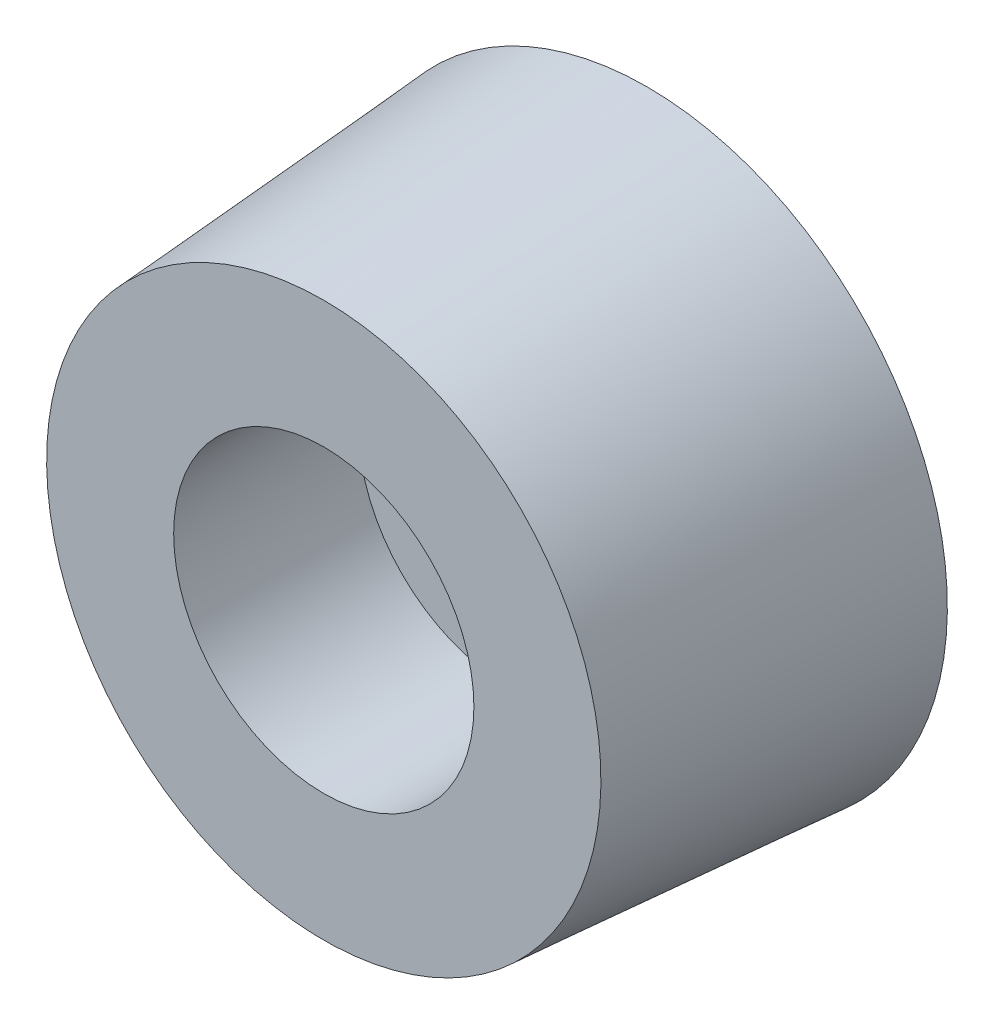
ISO-10303-21;
HEADER;
FILE_DESCRIPTION(('STEP AP214'),'2;1');
FILE_NAME('part.step','',(''),(''),'','','');
FILE_SCHEMA(('AUTOMOTIVE_DESIGN { 1 0 10303 214 1 1 1 1 }'));
ENDSEC;
DATA;
#1=APPLICATION_CONTEXT('core data for automotive mechanical design processes');
#2=APPLICATION_PROTOCOL_DEFINITION('international standard','automotive_design',2000,#1);
#3=PRODUCT_CONTEXT('',#1,'mechanical');
#4=PRODUCT('Part','Part','',(#3));
#5=PRODUCT_RELATED_PRODUCT_CATEGORY('part','',(#4));
#6=PRODUCT_DEFINITION_FORMATION('','',#4);
#7=PRODUCT_DEFINITION_CONTEXT('part definition',#1,'design');
#8=PRODUCT_DEFINITION('design','',#6,#7);
#9=PRODUCT_DEFINITION_SHAPE('','',#8);
#10=(LENGTH_UNIT() NAMED_UNIT(*) SI_UNIT(.MILLI.,.METRE.));
#11=(NAMED_UNIT(*) PLANE_ANGLE_UNIT() SI_UNIT($,.RADIAN.));
#12=(NAMED_UNIT(*) SI_UNIT($,.STERADIAN.) SOLID_ANGLE_UNIT());
#13=UNCERTAINTY_MEASURE_WITH_UNIT(LENGTH_MEASURE(1.E-05),#10,'distance_accuracy_value','');
#14=(GEOMETRIC_REPRESENTATION_CONTEXT(3) GLOBAL_UNCERTAINTY_ASSIGNED_CONTEXT((#13)) GLOBAL_UNIT_ASSIGNED_CONTEXT((#10,
#11,#12)) REPRESENTATION_CONTEXT('',''));
#15=CARTESIAN_POINT('',(0.,0.,0.));
#16=DIRECTION('',(0.,0.,1.));
#17=DIRECTION('',(1.,0.,0.));
#18=AXIS2_PLACEMENT_3D('',#15,#16,#17);
#19=CARTESIAN_POINT('',(0.,0.,1.70530256582424E-10));
#20=DIRECTION('',(0.,0.,-1.));
#21=DIRECTION('',(0.,1.,0.));
#22=AXIS2_PLACEMENT_3D('',#19,#20,#21);
#23=CONICAL_SURFACE('',#22,6.4999999999884,0.0713074647850017);
#24=CARTESIAN_POINT('',(0.,1.E-11,-1.E-11));
#25=DIRECTION('',(0.,1.53890562766888E-12,1.));
#26=DIRECTION('',(0.,1.,-1.53890562766888E-12));
#27=AXIS2_PLACEMENT_3D('',#24,#25,#26);
#28=CIRCLE('',#27,6.50000000001059);
#29=CARTESIAN_POINT('',(0.,6.50000000002059,-2.0002886579864E-11));
#30=VERTEX_POINT('',#29);
#31=EDGE_CURVE('E23',#30,#30,#28,.T.);
#32=ORIENTED_EDGE('',*,*,#31,.T.);
#33=EDGE_LOOP('',(#32));
#34=FACE_BOUND('',#33,.T.);
#35=CARTESIAN_POINT('',(0.,1.00031086244689E-11,7.000000000015));
#36=DIRECTION('',(0.,-1.66710034753225E-12,-1.));
#37=DIRECTION('',(0.,1.,-1.66710034753225E-12));
#38=AXIS2_PLACEMENT_3D('',#35,#36,#37);
#39=CIRCLE('',#38,6.00000000001226);
#40=CARTESIAN_POINT('',(0.,6.00000000002226,7.000000000005));
#41=VERTEX_POINT('',#40);
#42=EDGE_CURVE('E10',#41,#41,#39,.T.);
#43=ORIENTED_EDGE('',*,*,#42,.T.);
#44=EDGE_LOOP('',(#43));
#45=FACE_BOUND('',#44,.T.);
#46=ADVANCED_FACE('F15',(#34,#45),#23,.T.);
#47=CARTESIAN_POINT('',(0.,0.,7.));
#48=DIRECTION('',(0.,0.,-1.));
#49=DIRECTION('',(0.,1.,0.));
#50=AXIS2_PLACEMENT_3D('',#47,#48,#49);
#51=CYLINDRICAL_SURFACE('',#50,3.25);
#52=CARTESIAN_POINT('',(0.,1.00013322676295E-11,3.00000000001));
#53=DIRECTION('',(0.,3.07732339771575E-12,1.));
#54=DIRECTION('',(0.,1.,-3.07732339771575E-12));
#55=AXIS2_PLACEMENT_3D('',#52,#53,#54);
#56=CIRCLE('',#55,3.25000000001);
#57=CARTESIAN_POINT('',(0.,3.25000000002,3.));
#58=VERTEX_POINT('',#57);
#59=EDGE_CURVE('E44',#58,#58,#56,.T.);
#60=ORIENTED_EDGE('',*,*,#59,.F.);
#61=EDGE_LOOP('',(#60));
#62=FACE_BOUND('',#61,.T.);
#63=CARTESIAN_POINT('',(0.,1.00031086244689E-11,7.00000000001));
#64=DIRECTION('',(0.,-3.07745683798314E-12,-1.));
#65=DIRECTION('',(0.,1.,-3.07745683798314E-12));
#66=AXIS2_PLACEMENT_3D('',#63,#64,#65);
#67=CIRCLE('',#66,3.25000000001);
#68=CARTESIAN_POINT('',(0.,3.25000000002,7.));
#69=VERTEX_POINT('',#68);
#70=EDGE_CURVE('E41',#69,#69,#67,.T.);
#71=ORIENTED_EDGE('',*,*,#70,.F.);
#72=EDGE_LOOP('',(#71));
#73=FACE_BOUND('',#72,.T.);
#74=ADVANCED_FACE('F71',(#62,#73),#51,.F.);
#75=CARTESIAN_POINT('',(0.,0.,3.));
#76=DIRECTION('',(0.,0.,-1.));
#77=DIRECTION('',(0.,1.,0.));
#78=AXIS2_PLACEMENT_3D('',#75,#76,#77);
#79=CYLINDRICAL_SURFACE('',#78,1.6);
#80=CARTESIAN_POINT('',(0.,1.E-11,-1.E-11));
#81=DIRECTION('',(0.,-6.25044408917078E-12,-1.));
#82=DIRECTION('',(0.,1.,-6.25044408917078E-12));
#83=AXIS2_PLACEMENT_3D('',#80,#81,#82);
#84=CIRCLE('',#83,1.60000000001);
#85=CARTESIAN_POINT('',(0.,1.60000000002,-2.00007105427358E-11));
#86=VERTEX_POINT('',#85);
#87=EDGE_CURVE('E32',#86,#86,#84,.T.);
#88=ORIENTED_EDGE('',*,*,#87,.T.);
#89=EDGE_LOOP('',(#88));
#90=FACE_BOUND('',#89,.T.);
#91=CARTESIAN_POINT('',(0.,1.00013322676295E-11,3.00000000001));
#92=DIRECTION('',(0.,-6.25054210104718E-12,-1.));
#93=DIRECTION('',(0.,1.,-6.25054210104718E-12));
#94=AXIS2_PLACEMENT_3D('',#91,#92,#93);
#95=CIRCLE('',#94,1.60000000001);
#96=CARTESIAN_POINT('',(0.,1.60000000002,3.));
#97=VERTEX_POINT('',#96);
#98=EDGE_CURVE('E53',#97,#97,#95,.T.);
#99=ORIENTED_EDGE('',*,*,#98,.F.);
#100=EDGE_LOOP('',(#99));
#101=FACE_BOUND('',#100,.T.);
#102=ADVANCED_FACE('F68',(#90,#101),#79,.F.);
#103=CARTESIAN_POINT('',(0.,0.,7.));
#104=DIRECTION('',(0.,0.,1.));
#105=DIRECTION('',(1.,0.,0.));
#106=AXIS2_PLACEMENT_3D('',#103,#104,#105);
#107=PLANE('',#106);
#108=ORIENTED_EDGE('',*,*,#42,.F.);
#109=EDGE_LOOP('',(#108));
#110=FACE_BOUND('',#109,.T.);
#111=ORIENTED_EDGE('',*,*,#70,.T.);
#112=EDGE_LOOP('',(#111));
#113=FACE_BOUND('',#112,.T.);
#114=ADVANCED_FACE('F70',(#110,#113),#107,.T.);
#115=CARTESIAN_POINT('',(0.,0.,0.));
#116=DIRECTION('',(0.,0.,1.));
#117=DIRECTION('',(1.,0.,0.));
#118=AXIS2_PLACEMENT_3D('',#115,#116,#117);
#119=PLANE('',#118);
#120=ORIENTED_EDGE('',*,*,#31,.F.);
#121=EDGE_LOOP('',(#120));
#122=FACE_BOUND('',#121,.T.);
#123=ORIENTED_EDGE('',*,*,#87,.F.);
#124=EDGE_LOOP('',(#123));
#125=FACE_BOUND('',#124,.T.);
#126=ADVANCED_FACE('F17',(#122,#125),#119,.F.);
#127=CARTESIAN_POINT('',(0.,0.,3.));
#128=DIRECTION('',(0.,0.,1.));
#129=DIRECTION('',(1.,0.,0.));
#130=AXIS2_PLACEMENT_3D('',#127,#128,#129);
#131=PLANE('',#130);
#132=ORIENTED_EDGE('',*,*,#59,.T.);
#133=EDGE_LOOP('',(#132));
#134=FACE_BOUND('',#133,.T.);
#135=ORIENTED_EDGE('',*,*,#98,.T.);
#136=EDGE_LOOP('',(#135));
#137=FACE_BOUND('',#136,.T.);
#138=ADVANCED_FACE('F66',(#134,#137),#131,.T.);
#139=CLOSED_SHELL('',(#46,#74,#102,#114,#126,#138));
#140=MANIFOLD_SOLID_BREP('B1',#139);
#141=ADVANCED_BREP_SHAPE_REPRESENTATION('',(#18,#140),#14);
#142=SHAPE_DEFINITION_REPRESENTATION(#9,#141);
ENDSEC;
END-ISO-10303-21;
